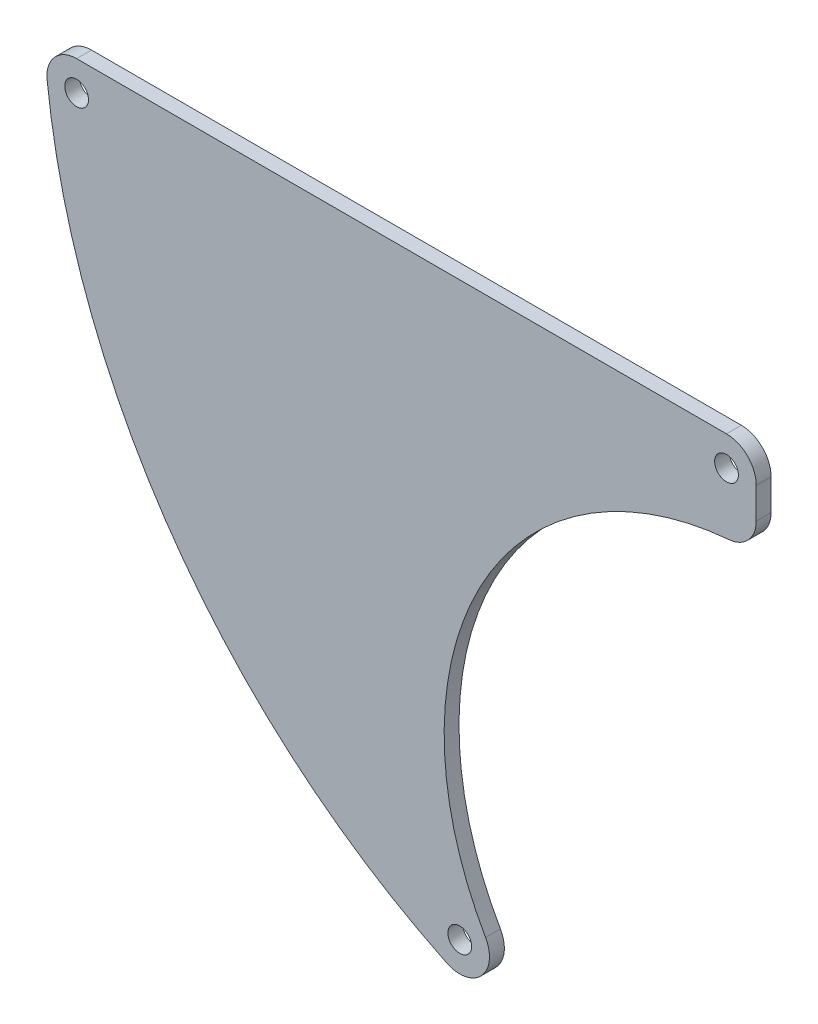
ISO-10303-21;
HEADER;
FILE_DESCRIPTION(('STEP AP214'),'2;1');
FILE_NAME('part.step','',(''),(''),'','','');
FILE_SCHEMA(('AUTOMOTIVE_DESIGN { 1 0 10303 214 1 1 1 1 }'));
ENDSEC;
DATA;
#1=APPLICATION_CONTEXT('core data for automotive mechanical design processes');
#2=APPLICATION_PROTOCOL_DEFINITION('international standard','automotive_design',2000,#1);
#3=PRODUCT_CONTEXT('',#1,'mechanical');
#4=PRODUCT('Part','Part','',(#3));
#5=PRODUCT_RELATED_PRODUCT_CATEGORY('part','',(#4));
#6=PRODUCT_DEFINITION_FORMATION('','',#4);
#7=PRODUCT_DEFINITION_CONTEXT('part definition',#1,'design');
#8=PRODUCT_DEFINITION('design','',#6,#7);
#9=PRODUCT_DEFINITION_SHAPE('','',#8);
#10=(LENGTH_UNIT() NAMED_UNIT(*) SI_UNIT(.MILLI.,.METRE.));
#11=(NAMED_UNIT(*) PLANE_ANGLE_UNIT() SI_UNIT($,.RADIAN.));
#12=(NAMED_UNIT(*) SI_UNIT($,.STERADIAN.) SOLID_ANGLE_UNIT());
#13=UNCERTAINTY_MEASURE_WITH_UNIT(LENGTH_MEASURE(1.E-05),#10,'distance_accuracy_value','');
#14=(GEOMETRIC_REPRESENTATION_CONTEXT(3) GLOBAL_UNCERTAINTY_ASSIGNED_CONTEXT((#13)) GLOBAL_UNIT_ASSIGNED_CONTEXT((#10,
#11,#12)) REPRESENTATION_CONTEXT('',''));
#15=CARTESIAN_POINT('',(0.,0.,0.));
#16=DIRECTION('',(0.,0.,1.));
#17=DIRECTION('',(1.,0.,0.));
#18=AXIS2_PLACEMENT_3D('',#15,#16,#17);
#19=CARTESIAN_POINT('',(-19.9473682474656,6.55000000000001,1.));
#20=DIRECTION('',(0.,0.,1.));
#21=DIRECTION('',(1.,0.,0.));
#22=AXIS2_PLACEMENT_3D('',#19,#20,#21);
#23=PLANE('',#22);
#24=CARTESIAN_POINT('',(-45.7274534606947,43.,1.));
#25=DIRECTION('',(0.,0.,1.));
#26=DIRECTION('',(1.,0.,0.));
#27=AXIS2_PLACEMENT_3D('',#24,#25,#26);
#28=CIRCLE('',#27,0.800000000000003);
#29=CARTESIAN_POINT('',(-44.9274534606947,43.,1.));
#30=VERTEX_POINT('',#29);
#31=EDGE_CURVE('E184',#30,#30,#28,.T.);
#32=ORIENTED_EDGE('',*,*,#31,.F.);
#33=EDGE_LOOP('',(#32));
#34=FACE_BOUND('',#33,.T.);
#35=CARTESIAN_POINT('',(-19.9473682474656,6.55000000000001,1.));
#36=DIRECTION('',(0.,0.,1.));
#37=DIRECTION('',(1.,0.,0.));
#38=AXIS2_PLACEMENT_3D('',#35,#36,#37);
#39=CIRCLE('',#38,2.00000000000001);
#40=CARTESIAN_POINT('',(-20.8146451277902,4.74782608695651,1.));
#41=VERTEX_POINT('',#40);
#42=CARTESIAN_POINT('',(-18.2128144868164,7.54565217391305,1.));
#43=VERTEX_POINT('',#42);
#44=EDGE_CURVE('E147',#41,#43,#39,.T.);
#45=ORIENTED_EDGE('',*,*,#44,.T.);
#46=CARTESIAN_POINT('',(0.,18.,1.));
#47=DIRECTION('',(0.,0.,-1.));
#48=DIRECTION('',(1.,0.,0.));
#49=AXIS2_PLACEMENT_3D('',#46,#47,#48);
#50=CIRCLE('',#49,21.);
#51=CARTESIAN_POINT('',(-1.82608695652174,38.920454259581,1.));
#52=VERTEX_POINT('',#51);
#53=EDGE_CURVE('E95',#43,#52,#50,.T.);
#54=ORIENTED_EDGE('',*,*,#53,.T.);
#55=CARTESIAN_POINT('',(-2.,40.9128784747792,1.));
#56=DIRECTION('',(0.,0.,1.));
#57=DIRECTION('',(-1.,0.,0.));
#58=AXIS2_PLACEMENT_3D('',#55,#56,#57);
#59=CIRCLE('',#58,2.);
#60=CARTESIAN_POINT('',(0.,40.9128784747792,1.));
#61=VERTEX_POINT('',#60);
#62=EDGE_CURVE('E162',#52,#61,#59,.T.);
#63=ORIENTED_EDGE('',*,*,#62,.T.);
#64=DIRECTION('',(0.,1.,0.));
#65=VECTOR('',#64,1.);
#66=CARTESIAN_POINT('',(0.,40.9128784747792,1.));
#67=LINE('',#66,#65);
#68=CARTESIAN_POINT('',(0.,43.,1.));
#69=VERTEX_POINT('',#68);
#70=EDGE_CURVE('E175',#61,#69,#67,.T.);
#71=ORIENTED_EDGE('',*,*,#70,.T.);
#72=CARTESIAN_POINT('',(-2.,43.,1.));
#73=DIRECTION('',(0.,0.,1.));
#74=DIRECTION('',(1.,0.,0.));
#75=AXIS2_PLACEMENT_3D('',#72,#73,#74);
#76=CIRCLE('',#75,2.);
#77=CARTESIAN_POINT('',(-2.,45.,1.));
#78=VERTEX_POINT('',#77);
#79=EDGE_CURVE('E114',#69,#78,#76,.T.);
#80=ORIENTED_EDGE('',*,*,#79,.T.);
#81=DIRECTION('',(-1.,0.,0.));
#82=VECTOR('',#81,1.);
#83=CARTESIAN_POINT('',(-2.,45.,1.));
#84=LINE('',#83,#82);
#85=CARTESIAN_POINT('',(-45.7274534606947,45.,1.));
#86=VERTEX_POINT('',#85);
#87=EDGE_CURVE('E108',#78,#86,#84,.T.);
#88=ORIENTED_EDGE('',*,*,#87,.T.);
#89=CARTESIAN_POINT('',(-45.7274534606947,43.,1.));
#90=DIRECTION('',(0.,0.,1.));
#91=DIRECTION('',(-1.,0.,0.));
#92=AXIS2_PLACEMENT_3D('',#89,#90,#91);
#93=CIRCLE('',#92,2.00000000000001);
#94=CARTESIAN_POINT('',(-47.7156036111597,42.7826086956522,1.));
#95=VERTEX_POINT('',#94);
#96=EDGE_CURVE('E112',#86,#95,#93,.T.);
#97=ORIENTED_EDGE('',*,*,#96,.T.);
#98=CARTESIAN_POINT('',(0.,48.,1.));
#99=DIRECTION('',(0.,0.,1.));
#100=DIRECTION('',(1.,0.,0.));
#101=AXIS2_PLACEMENT_3D('',#98,#99,#100);
#102=CIRCLE('',#101,48.);
#103=EDGE_CURVE('E52',#95,#41,#102,.T.);
#104=ORIENTED_EDGE('',*,*,#103,.T.);
#105=EDGE_LOOP('',(#45,#54,#63,#71,#80,#88,#97,#104));
#106=FACE_BOUND('',#105,.T.);
#107=CARTESIAN_POINT('',(-19.9473682474656,6.55000000000001,1.));
#108=DIRECTION('',(0.,0.,1.));
#109=DIRECTION('',(1.,0.,0.));
#110=AXIS2_PLACEMENT_3D('',#107,#108,#109);
#111=CIRCLE('',#110,0.799999999999999);
#112=CARTESIAN_POINT('',(-19.1473682474656,6.55000000000001,1.));
#113=VERTEX_POINT('',#112);
#114=EDGE_CURVE('E136',#113,#113,#111,.T.);
#115=ORIENTED_EDGE('',*,*,#114,.F.);
#116=EDGE_LOOP('',(#115));
#117=FACE_BOUND('',#116,.T.);
#118=CARTESIAN_POINT('',(-2.,43.,1.));
#119=DIRECTION('',(0.,0.,1.));
#120=DIRECTION('',(1.,0.,0.));
#121=AXIS2_PLACEMENT_3D('',#118,#119,#120);
#122=CIRCLE('',#121,0.800000000000001);
#123=CARTESIAN_POINT('',(-1.2,43.,1.));
#124=VERTEX_POINT('',#123);
#125=EDGE_CURVE('E190',#124,#124,#122,.T.);
#126=ORIENTED_EDGE('',*,*,#125,.F.);
#127=EDGE_LOOP('',(#126));
#128=FACE_BOUND('',#127,.T.);
#129=ADVANCED_FACE('F35',(#34,#106,#117,#128),#23,.T.);
#130=CARTESIAN_POINT('',(-19.9473682474656,6.55000000000001,0.));
#131=DIRECTION('',(0.,0.,1.));
#132=DIRECTION('',(1.,0.,0.));
#133=AXIS2_PLACEMENT_3D('',#130,#131,#132);
#134=PLANE('',#133);
#135=CARTESIAN_POINT('',(-19.9473682474656,6.55000000000001,0.));
#136=DIRECTION('',(0.,0.,1.));
#137=DIRECTION('',(1.,0.,0.));
#138=AXIS2_PLACEMENT_3D('',#135,#136,#137);
#139=CIRCLE('',#138,2.00000000000001);
#140=CARTESIAN_POINT('',(-20.8146451277902,4.74782608695651,0.));
#141=VERTEX_POINT('',#140);
#142=CARTESIAN_POINT('',(-18.2128144868164,7.54565217391305,0.));
#143=VERTEX_POINT('',#142);
#144=EDGE_CURVE('E132',#141,#143,#139,.T.);
#145=ORIENTED_EDGE('',*,*,#144,.F.);
#146=CARTESIAN_POINT('',(0.,48.,0.));
#147=DIRECTION('',(0.,0.,1.));
#148=DIRECTION('',(1.,0.,0.));
#149=AXIS2_PLACEMENT_3D('',#146,#147,#148);
#150=CIRCLE('',#149,48.);
#151=CARTESIAN_POINT('',(-47.7156036111597,42.7826086956522,0.));
#152=VERTEX_POINT('',#151);
#153=EDGE_CURVE('E87',#152,#141,#150,.T.);
#154=ORIENTED_EDGE('',*,*,#153,.F.);
#155=CARTESIAN_POINT('',(-45.7274534606947,43.,0.));
#156=DIRECTION('',(0.,0.,1.));
#157=DIRECTION('',(-1.,0.,0.));
#158=AXIS2_PLACEMENT_3D('',#155,#156,#157);
#159=CIRCLE('',#158,2.00000000000001);
#160=CARTESIAN_POINT('',(-45.7274534606947,45.,0.));
#161=VERTEX_POINT('',#160);
#162=EDGE_CURVE('E81',#161,#152,#159,.T.);
#163=ORIENTED_EDGE('',*,*,#162,.F.);
#164=DIRECTION('',(-1.,0.,0.));
#165=VECTOR('',#164,1.);
#166=CARTESIAN_POINT('',(-2.,45.,0.));
#167=LINE('',#166,#165);
#168=CARTESIAN_POINT('',(-2.,45.,0.));
#169=VERTEX_POINT('',#168);
#170=EDGE_CURVE('E122',#169,#161,#167,.T.);
#171=ORIENTED_EDGE('',*,*,#170,.F.);
#172=CARTESIAN_POINT('',(-2.,43.,0.));
#173=DIRECTION('',(0.,0.,1.));
#174=DIRECTION('',(1.,0.,0.));
#175=AXIS2_PLACEMENT_3D('',#172,#173,#174);
#176=CIRCLE('',#175,2.);
#177=CARTESIAN_POINT('',(0.,43.,0.));
#178=VERTEX_POINT('',#177);
#179=EDGE_CURVE('E142',#178,#169,#176,.T.);
#180=ORIENTED_EDGE('',*,*,#179,.F.);
#181=DIRECTION('',(0.,1.,0.));
#182=VECTOR('',#181,1.);
#183=CARTESIAN_POINT('',(0.,40.9128784747792,0.));
#184=LINE('',#183,#182);
#185=CARTESIAN_POINT('',(0.,40.9128784747792,0.));
#186=VERTEX_POINT('',#185);
#187=EDGE_CURVE('E140',#186,#178,#184,.T.);
#188=ORIENTED_EDGE('',*,*,#187,.F.);
#189=CARTESIAN_POINT('',(-2.,40.9128784747792,0.));
#190=DIRECTION('',(0.,0.,1.));
#191=DIRECTION('',(-1.,0.,0.));
#192=AXIS2_PLACEMENT_3D('',#189,#190,#191);
#193=CIRCLE('',#192,2.);
#194=CARTESIAN_POINT('',(-1.82608695652174,38.920454259581,0.));
#195=VERTEX_POINT('',#194);
#196=EDGE_CURVE('E138',#195,#186,#193,.T.);
#197=ORIENTED_EDGE('',*,*,#196,.F.);
#198=CARTESIAN_POINT('',(0.,18.,0.));
#199=DIRECTION('',(0.,0.,-1.));
#200=DIRECTION('',(1.,0.,0.));
#201=AXIS2_PLACEMENT_3D('',#198,#199,#200);
#202=CIRCLE('',#201,21.);
#203=EDGE_CURVE('E135',#143,#195,#202,.T.);
#204=ORIENTED_EDGE('',*,*,#203,.F.);
#205=EDGE_LOOP('',(#145,#154,#163,#171,#180,#188,#197,#204));
#206=FACE_BOUND('',#205,.T.);
#207=CARTESIAN_POINT('',(-19.9473682474656,6.55000000000001,0.));
#208=DIRECTION('',(0.,0.,1.));
#209=DIRECTION('',(1.,0.,0.));
#210=AXIS2_PLACEMENT_3D('',#207,#208,#209);
#211=CIRCLE('',#210,0.799999999999999);
#212=CARTESIAN_POINT('',(-19.1473682474656,6.55000000000001,0.));
#213=VERTEX_POINT('',#212);
#214=EDGE_CURVE('E181',#213,#213,#211,.T.);
#215=ORIENTED_EDGE('',*,*,#214,.T.);
#216=EDGE_LOOP('',(#215));
#217=FACE_BOUND('',#216,.T.);
#218=CARTESIAN_POINT('',(-45.7274534606947,43.,0.));
#219=DIRECTION('',(0.,0.,1.));
#220=DIRECTION('',(1.,0.,0.));
#221=AXIS2_PLACEMENT_3D('',#218,#219,#220);
#222=CIRCLE('',#221,0.800000000000003);
#223=CARTESIAN_POINT('',(-44.9274534606947,43.,0.));
#224=VERTEX_POINT('',#223);
#225=EDGE_CURVE('E187',#224,#224,#222,.T.);
#226=ORIENTED_EDGE('',*,*,#225,.T.);
#227=EDGE_LOOP('',(#226));
#228=FACE_BOUND('',#227,.T.);
#229=CARTESIAN_POINT('',(-2.,43.,0.));
#230=DIRECTION('',(0.,0.,1.));
#231=DIRECTION('',(1.,0.,0.));
#232=AXIS2_PLACEMENT_3D('',#229,#230,#231);
#233=CIRCLE('',#232,0.800000000000001);
#234=CARTESIAN_POINT('',(-1.2,43.,0.));
#235=VERTEX_POINT('',#234);
#236=EDGE_CURVE('E193',#235,#235,#233,.T.);
#237=ORIENTED_EDGE('',*,*,#236,.T.);
#238=EDGE_LOOP('',(#237));
#239=FACE_BOUND('',#238,.T.);
#240=ADVANCED_FACE('F166',(#206,#217,#228,#239),#134,.F.);
#241=CARTESIAN_POINT('',(-19.9473682474656,6.55000000000001,1.));
#242=DIRECTION('',(0.,0.,-1.));
#243=DIRECTION('',(-1.,0.,0.));
#244=AXIS2_PLACEMENT_3D('',#241,#242,#243);
#245=CYLINDRICAL_SURFACE('',#244,2.00000000000001);
#246=ORIENTED_EDGE('',*,*,#144,.T.);
#247=DIRECTION('',(0.,0.,-1.));
#248=VECTOR('',#247,1.);
#249=CARTESIAN_POINT('',(-18.2128144868164,7.54565217391305,1.));
#250=LINE('',#249,#248);
#251=EDGE_CURVE('E11',#43,#143,#250,.T.);
#252=ORIENTED_EDGE('',*,*,#251,.F.);
#253=ORIENTED_EDGE('',*,*,#44,.F.);
#254=DIRECTION('',(0.,0.,-1.));
#255=VECTOR('',#254,1.);
#256=CARTESIAN_POINT('',(-20.8146451277902,4.74782608695651,1.));
#257=LINE('',#256,#255);
#258=EDGE_CURVE('E128',#41,#141,#257,.T.);
#259=ORIENTED_EDGE('',*,*,#258,.T.);
#260=EDGE_LOOP('',(#246,#252,#253,#259));
#261=FACE_BOUND('',#260,.T.);
#262=ADVANCED_FACE('F37',(#261),#245,.T.);
#263=CARTESIAN_POINT('',(0.,18.,1.));
#264=DIRECTION('',(0.,0.,-1.));
#265=DIRECTION('',(-1.,0.,0.));
#266=AXIS2_PLACEMENT_3D('',#263,#264,#265);
#267=CYLINDRICAL_SURFACE('',#266,21.);
#268=ORIENTED_EDGE('',*,*,#203,.T.);
#269=DIRECTION('',(0.,0.,-1.));
#270=VECTOR('',#269,1.);
#271=CARTESIAN_POINT('',(-1.82608695652174,38.920454259581,1.));
#272=LINE('',#271,#270);
#273=EDGE_CURVE('E44',#52,#195,#272,.T.);
#274=ORIENTED_EDGE('',*,*,#273,.F.);
#275=ORIENTED_EDGE('',*,*,#53,.F.);
#276=ORIENTED_EDGE('',*,*,#251,.T.);
#277=EDGE_LOOP('',(#268,#274,#275,#276));
#278=FACE_BOUND('',#277,.T.);
#279=ADVANCED_FACE('F226',(#278),#267,.F.);
#280=CARTESIAN_POINT('',(-2.,40.9128784747792,1.));
#281=DIRECTION('',(0.,0.,-1.));
#282=DIRECTION('',(-1.,0.,0.));
#283=AXIS2_PLACEMENT_3D('',#280,#281,#282);
#284=CYLINDRICAL_SURFACE('',#283,2.);
#285=ORIENTED_EDGE('',*,*,#196,.T.);
#286=DIRECTION('',(0.,0.,-1.));
#287=VECTOR('',#286,1.);
#288=CARTESIAN_POINT('',(0.,40.9128784747792,1.));
#289=LINE('',#288,#287);
#290=EDGE_CURVE('E154',#61,#186,#289,.T.);
#291=ORIENTED_EDGE('',*,*,#290,.F.);
#292=ORIENTED_EDGE('',*,*,#62,.F.);
#293=ORIENTED_EDGE('',*,*,#273,.T.);
#294=EDGE_LOOP('',(#285,#291,#292,#293));
#295=FACE_BOUND('',#294,.T.);
#296=ADVANCED_FACE('F160',(#295),#284,.T.);
#297=CARTESIAN_POINT('',(0.,40.9128784747792,1.));
#298=DIRECTION('',(-1.,0.,0.));
#299=DIRECTION('',(0.,0.,1.));
#300=AXIS2_PLACEMENT_3D('',#297,#298,#299);
#301=PLANE('',#300);
#302=ORIENTED_EDGE('',*,*,#187,.T.);
#303=DIRECTION('',(0.,0.,-1.));
#304=VECTOR('',#303,1.);
#305=CARTESIAN_POINT('',(0.,43.,1.));
#306=LINE('',#305,#304);
#307=EDGE_CURVE('E151',#69,#178,#306,.T.);
#308=ORIENTED_EDGE('',*,*,#307,.F.);
#309=ORIENTED_EDGE('',*,*,#70,.F.);
#310=ORIENTED_EDGE('',*,*,#290,.T.);
#311=EDGE_LOOP('',(#302,#308,#309,#310));
#312=FACE_BOUND('',#311,.T.);
#313=ADVANCED_FACE('F171',(#312),#301,.F.);
#314=CARTESIAN_POINT('',(-2.,43.,1.));
#315=DIRECTION('',(0.,0.,-1.));
#316=DIRECTION('',(-1.,0.,0.));
#317=AXIS2_PLACEMENT_3D('',#314,#315,#316);
#318=CYLINDRICAL_SURFACE('',#317,2.);
#319=ORIENTED_EDGE('',*,*,#179,.T.);
#320=DIRECTION('',(0.,0.,-1.));
#321=VECTOR('',#320,1.);
#322=CARTESIAN_POINT('',(-2.,45.,1.));
#323=LINE('',#322,#321);
#324=EDGE_CURVE('E123',#78,#169,#323,.T.);
#325=ORIENTED_EDGE('',*,*,#324,.F.);
#326=ORIENTED_EDGE('',*,*,#79,.F.);
#327=ORIENTED_EDGE('',*,*,#307,.T.);
#328=EDGE_LOOP('',(#319,#325,#326,#327));
#329=FACE_BOUND('',#328,.T.);
#330=ADVANCED_FACE('F174',(#329),#318,.T.);
#331=CARTESIAN_POINT('',(-2.,45.,1.));
#332=DIRECTION('',(0.,-1.,0.));
#333=DIRECTION('',(0.,0.,-1.));
#334=AXIS2_PLACEMENT_3D('',#331,#332,#333);
#335=PLANE('',#334);
#336=ORIENTED_EDGE('',*,*,#170,.T.);
#337=DIRECTION('',(0.,0.,-1.));
#338=VECTOR('',#337,1.);
#339=CARTESIAN_POINT('',(-45.7274534606947,45.,1.));
#340=LINE('',#339,#338);
#341=EDGE_CURVE('E119',#86,#161,#340,.T.);
#342=ORIENTED_EDGE('',*,*,#341,.F.);
#343=ORIENTED_EDGE('',*,*,#87,.F.);
#344=ORIENTED_EDGE('',*,*,#324,.T.);
#345=EDGE_LOOP('',(#336,#342,#343,#344));
#346=FACE_BOUND('',#345,.T.);
#347=ADVANCED_FACE('F120',(#346),#335,.F.);
#348=CARTESIAN_POINT('',(-45.7274534606947,43.,1.));
#349=DIRECTION('',(0.,0.,-1.));
#350=DIRECTION('',(-1.,0.,0.));
#351=AXIS2_PLACEMENT_3D('',#348,#349,#350);
#352=CYLINDRICAL_SURFACE('',#351,2.00000000000001);
#353=ORIENTED_EDGE('',*,*,#162,.T.);
#354=DIRECTION('',(0.,0.,-1.));
#355=VECTOR('',#354,1.);
#356=CARTESIAN_POINT('',(-47.7156036111597,42.7826086956522,1.));
#357=LINE('',#356,#355);
#358=EDGE_CURVE('E124',#95,#152,#357,.T.);
#359=ORIENTED_EDGE('',*,*,#358,.F.);
#360=ORIENTED_EDGE('',*,*,#96,.F.);
#361=ORIENTED_EDGE('',*,*,#341,.T.);
#362=EDGE_LOOP('',(#353,#359,#360,#361));
#363=FACE_BOUND('',#362,.T.);
#364=ADVANCED_FACE('F126',(#363),#352,.T.);
#365=CARTESIAN_POINT('',(0.,48.,1.));
#366=DIRECTION('',(0.,0.,-1.));
#367=DIRECTION('',(-1.,0.,0.));
#368=AXIS2_PLACEMENT_3D('',#365,#366,#367);
#369=CYLINDRICAL_SURFACE('',#368,48.);
#370=ORIENTED_EDGE('',*,*,#153,.T.);
#371=ORIENTED_EDGE('',*,*,#258,.F.);
#372=ORIENTED_EDGE('',*,*,#103,.F.);
#373=ORIENTED_EDGE('',*,*,#358,.T.);
#374=EDGE_LOOP('',(#370,#371,#372,#373));
#375=FACE_BOUND('',#374,.T.);
#376=ADVANCED_FACE('F214',(#375),#369,.T.);
#377=CARTESIAN_POINT('',(-19.9473682474656,6.55000000000001,1.));
#378=DIRECTION('',(0.,0.,-1.));
#379=DIRECTION('',(-1.,0.,0.));
#380=AXIS2_PLACEMENT_3D('',#377,#378,#379);
#381=CYLINDRICAL_SURFACE('',#380,0.799999999999999);
#382=ORIENTED_EDGE('',*,*,#114,.T.);
#383=EDGE_LOOP('',(#382));
#384=FACE_BOUND('',#383,.T.);
#385=ORIENTED_EDGE('',*,*,#214,.F.);
#386=EDGE_LOOP('',(#385));
#387=FACE_BOUND('',#386,.T.);
#388=ADVANCED_FACE('F211',(#384,#387),#381,.F.);
#389=CARTESIAN_POINT('',(-45.7274534606947,43.,1.));
#390=DIRECTION('',(0.,0.,-1.));
#391=DIRECTION('',(-1.,0.,0.));
#392=AXIS2_PLACEMENT_3D('',#389,#390,#391);
#393=CYLINDRICAL_SURFACE('',#392,0.800000000000003);
#394=ORIENTED_EDGE('',*,*,#31,.T.);
#395=EDGE_LOOP('',(#394));
#396=FACE_BOUND('',#395,.T.);
#397=ORIENTED_EDGE('',*,*,#225,.F.);
#398=EDGE_LOOP('',(#397));
#399=FACE_BOUND('',#398,.T.);
#400=ADVANCED_FACE('F290',(#396,#399),#393,.F.);
#401=CARTESIAN_POINT('',(-2.,43.,1.));
#402=DIRECTION('',(0.,0.,-1.));
#403=DIRECTION('',(-1.,0.,0.));
#404=AXIS2_PLACEMENT_3D('',#401,#402,#403);
#405=CYLINDRICAL_SURFACE('',#404,0.800000000000001);
#406=ORIENTED_EDGE('',*,*,#125,.T.);
#407=EDGE_LOOP('',(#406));
#408=FACE_BOUND('',#407,.T.);
#409=ORIENTED_EDGE('',*,*,#236,.F.);
#410=EDGE_LOOP('',(#409));
#411=FACE_BOUND('',#410,.T.);
#412=ADVANCED_FACE('F199',(#408,#411),#405,.F.);
#413=CLOSED_SHELL('',(#129,#240,#262,#279,#296,#313,#330,#347,#364,#376,#388,#400,#412));
#414=MANIFOLD_SOLID_BREP('B2',#413);
#415=ADVANCED_BREP_SHAPE_REPRESENTATION('',(#18,#414),#14);
#416=SHAPE_DEFINITION_REPRESENTATION(#9,#415);
ENDSEC;
END-ISO-10303-21;
